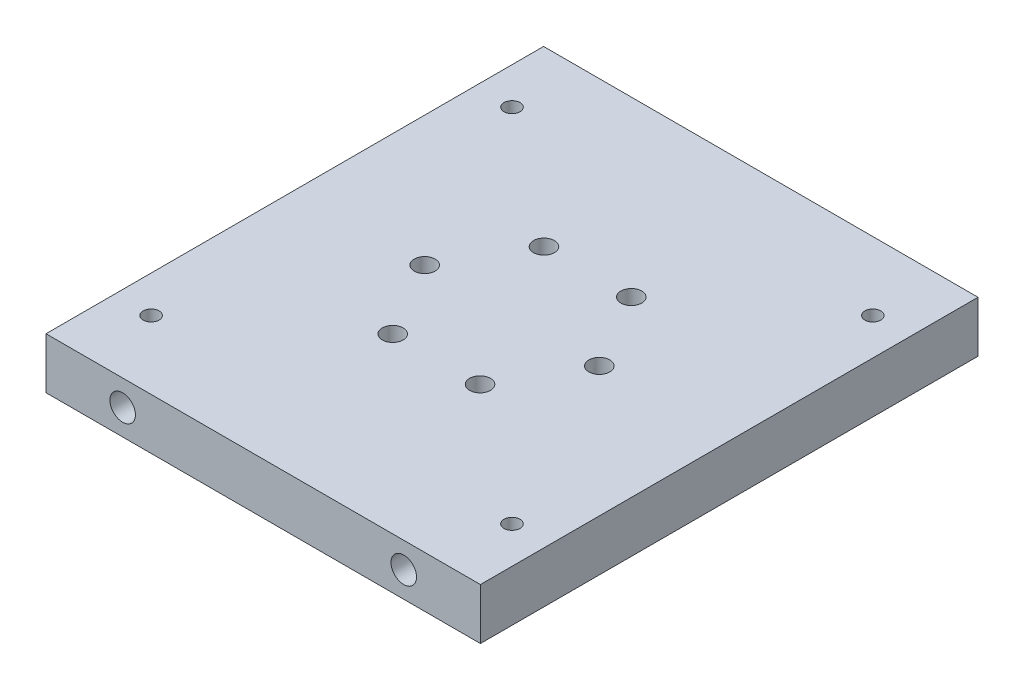
ISO-10303-21;
HEADER;
FILE_DESCRIPTION(('STEP AP214'),'2;1');
FILE_NAME('part.step','',(''),(''),'','','');
FILE_SCHEMA(('AUTOMOTIVE_DESIGN { 1 0 10303 214 1 1 1 1 }'));
ENDSEC;
DATA;
#1=APPLICATION_CONTEXT('core data for automotive mechanical design processes');
#2=APPLICATION_PROTOCOL_DEFINITION('international standard','automotive_design',2000,#1);
#3=PRODUCT_CONTEXT('',#1,'mechanical');
#4=PRODUCT('Part','Part','',(#3));
#5=PRODUCT_RELATED_PRODUCT_CATEGORY('part','',(#4));
#6=PRODUCT_DEFINITION_FORMATION('','',#4);
#7=PRODUCT_DEFINITION_CONTEXT('part definition',#1,'design');
#8=PRODUCT_DEFINITION('design','',#6,#7);
#9=PRODUCT_DEFINITION_SHAPE('','',#8);
#10=(LENGTH_UNIT() NAMED_UNIT(*) SI_UNIT(.MILLI.,.METRE.));
#11=(NAMED_UNIT(*) PLANE_ANGLE_UNIT() SI_UNIT($,.RADIAN.));
#12=(NAMED_UNIT(*) SI_UNIT($,.STERADIAN.) SOLID_ANGLE_UNIT());
#13=UNCERTAINTY_MEASURE_WITH_UNIT(LENGTH_MEASURE(1.E-05),#10,'distance_accuracy_value','');
#14=(GEOMETRIC_REPRESENTATION_CONTEXT(3) GLOBAL_UNCERTAINTY_ASSIGNED_CONTEXT((#13)) GLOBAL_UNIT_ASSIGNED_CONTEXT((#10,
#11,#12)) REPRESENTATION_CONTEXT('',''));
#15=CARTESIAN_POINT('',(0.,0.,0.));
#16=DIRECTION('',(0.,0.,1.));
#17=DIRECTION('',(1.,0.,0.));
#18=AXIS2_PLACEMENT_3D('',#15,#16,#17);
#19=CARTESIAN_POINT('',(0.,0.,123.65));
#20=DIRECTION('',(1.,0.,0.));
#21=DIRECTION('',(0.,1.,0.));
#22=AXIS2_PLACEMENT_3D('',#19,#20,#21);
#23=PLANE('',#22);
#24=DIRECTION('',(0.,-1.,0.));
#25=VECTOR('',#24,1.);
#26=CARTESIAN_POINT('',(0.,0.,0.));
#27=LINE('',#26,#25);
#28=CARTESIAN_POINT('',(0.,0.,0.));
#29=VERTEX_POINT('',#28);
#30=CARTESIAN_POINT('',(0.,-12.7,0.));
#31=VERTEX_POINT('',#30);
#32=EDGE_CURVE('E115',#29,#31,#27,.T.);
#33=ORIENTED_EDGE('',*,*,#32,.T.);
#34=DIRECTION('',(0.,0.,-1.));
#35=VECTOR('',#34,1.);
#36=CARTESIAN_POINT('',(0.,-12.7,123.65));
#37=LINE('',#36,#35);
#38=CARTESIAN_POINT('',(0.,-12.7,123.65));
#39=VERTEX_POINT('',#38);
#40=EDGE_CURVE('E11',#39,#31,#37,.T.);
#41=ORIENTED_EDGE('',*,*,#40,.F.);
#42=DIRECTION('',(0.,-1.,0.));
#43=VECTOR('',#42,1.);
#44=CARTESIAN_POINT('',(0.,0.,123.65));
#45=LINE('',#44,#43);
#46=CARTESIAN_POINT('',(0.,0.,123.65));
#47=VERTEX_POINT('',#46);
#48=EDGE_CURVE('E99',#47,#39,#45,.T.);
#49=ORIENTED_EDGE('',*,*,#48,.F.);
#50=DIRECTION('',(0.,0.,-1.));
#51=VECTOR('',#50,1.);
#52=CARTESIAN_POINT('',(0.,0.,123.65));
#53=LINE('',#52,#51);
#54=EDGE_CURVE('E111',#47,#29,#53,.T.);
#55=ORIENTED_EDGE('',*,*,#54,.T.);
#56=EDGE_LOOP('',(#33,#41,#49,#55));
#57=FACE_BOUND('',#56,.T.);
#58=ADVANCED_FACE('F47',(#57),#23,.F.);
#59=CARTESIAN_POINT('',(0.,-12.7,123.65));
#60=DIRECTION('',(0.,1.,0.));
#61=DIRECTION('',(0.,0.,1.));
#62=AXIS2_PLACEMENT_3D('',#59,#60,#61);
#63=PLANE('',#62);
#64=CARTESIAN_POINT('',(32.275,-12.7,61.825));
#65=DIRECTION('',(0.,1.,0.));
#66=DIRECTION('',(0.,0.,1.));
#67=AXIS2_PLACEMENT_3D('',#64,#65,#66);
#68=CIRCLE('',#67,2.6);
#69=CARTESIAN_POINT('',(32.275,-12.7,64.425));
#70=VERTEX_POINT('',#69);
#71=EDGE_CURVE('E181',#70,#70,#68,.T.);
#72=ORIENTED_EDGE('',*,*,#71,.T.);
#73=EDGE_LOOP('',(#72));
#74=FACE_BOUND('',#73,.T.);
#75=CARTESIAN_POINT('',(43.1249999999998,-12.7,80.6177512621222));
#76=DIRECTION('',(0.,1.,0.));
#77=DIRECTION('',(0.,0.,1.));
#78=AXIS2_PLACEMENT_3D('',#75,#76,#77);
#79=CIRCLE('',#78,2.6);
#80=CARTESIAN_POINT('',(43.1249999999998,-12.7,83.2177512621222));
#81=VERTEX_POINT('',#80);
#82=EDGE_CURVE('E234',#81,#81,#79,.T.);
#83=ORIENTED_EDGE('',*,*,#82,.T.);
#84=EDGE_LOOP('',(#83));
#85=FACE_BOUND('',#84,.T.);
#86=CARTESIAN_POINT('',(64.8249999999998,-12.7,80.6177512621224));
#87=DIRECTION('',(0.,1.,0.));
#88=DIRECTION('',(0.,0.,1.));
#89=AXIS2_PLACEMENT_3D('',#86,#87,#88);
#90=CIRCLE('',#89,2.59999999999998);
#91=CARTESIAN_POINT('',(64.8249999999998,-12.7,83.2177512621224));
#92=VERTEX_POINT('',#91);
#93=EDGE_CURVE('E200',#92,#92,#90,.T.);
#94=ORIENTED_EDGE('',*,*,#93,.T.);
#95=EDGE_LOOP('',(#94));
#96=FACE_BOUND('',#95,.T.);
#97=CARTESIAN_POINT('',(75.675,-12.7,61.8250000000002));
#98=DIRECTION('',(0.,1.,0.));
#99=DIRECTION('',(0.,0.,1.));
#100=AXIS2_PLACEMENT_3D('',#97,#98,#99);
#101=CIRCLE('',#100,2.6);
#102=CARTESIAN_POINT('',(75.675,-12.7,64.4250000000002));
#103=VERTEX_POINT('',#102);
#104=EDGE_CURVE('E209',#103,#103,#101,.T.);
#105=ORIENTED_EDGE('',*,*,#104,.T.);
#106=EDGE_LOOP('',(#105));
#107=FACE_BOUND('',#106,.T.);
#108=CARTESIAN_POINT('',(64.8250000000001,-12.7,43.0322487378777));
#109=DIRECTION('',(0.,1.,0.));
#110=DIRECTION('',(0.,0.,1.));
#111=AXIS2_PLACEMENT_3D('',#108,#109,#110);
#112=CIRCLE('',#111,2.6);
#113=CARTESIAN_POINT('',(64.8250000000001,-12.7,45.6322487378777));
#114=VERTEX_POINT('',#113);
#115=EDGE_CURVE('E217',#114,#114,#112,.T.);
#116=ORIENTED_EDGE('',*,*,#115,.T.);
#117=EDGE_LOOP('',(#116));
#118=FACE_BOUND('',#117,.T.);
#119=CARTESIAN_POINT('',(43.125,-12.7,43.0322487378777));
#120=DIRECTION('',(0.,1.,0.));
#121=DIRECTION('',(0.,0.,1.));
#122=AXIS2_PLACEMENT_3D('',#119,#120,#121);
#123=CIRCLE('',#122,2.6);
#124=CARTESIAN_POINT('',(43.125,-12.7,45.6322487378777));
#125=VERTEX_POINT('',#124);
#126=EDGE_CURVE('E225',#125,#125,#123,.T.);
#127=ORIENTED_EDGE('',*,*,#126,.T.);
#128=EDGE_LOOP('',(#127));
#129=FACE_BOUND('',#128,.T.);
#130=CARTESIAN_POINT('',(9.14,-12.7,16.99));
#131=DIRECTION('',(0.,1.,0.));
#132=DIRECTION('',(0.,0.,1.));
#133=AXIS2_PLACEMENT_3D('',#130,#131,#132);
#134=CIRCLE('',#133,1.985);
#135=CARTESIAN_POINT('',(9.14,-12.7,18.975));
#136=VERTEX_POINT('',#135);
#137=EDGE_CURVE('E176',#136,#136,#134,.T.);
#138=ORIENTED_EDGE('',*,*,#137,.T.);
#139=EDGE_LOOP('',(#138));
#140=FACE_BOUND('',#139,.T.);
#141=CARTESIAN_POINT('',(9.135,-12.7,106.665));
#142=DIRECTION('',(0.,1.,0.));
#143=DIRECTION('',(0.,0.,1.));
#144=AXIS2_PLACEMENT_3D('',#141,#142,#143);
#145=CIRCLE('',#144,1.985);
#146=CARTESIAN_POINT('',(9.135,-12.7,108.65));
#147=VERTEX_POINT('',#146);
#148=EDGE_CURVE('E185',#147,#147,#145,.T.);
#149=ORIENTED_EDGE('',*,*,#148,.T.);
#150=EDGE_LOOP('',(#149));
#151=FACE_BOUND('',#150,.T.);
#152=CARTESIAN_POINT('',(98.81,-12.7,106.665));
#153=DIRECTION('',(0.,1.,0.));
#154=DIRECTION('',(0.,0.,1.));
#155=AXIS2_PLACEMENT_3D('',#152,#153,#154);
#156=CIRCLE('',#155,1.985);
#157=CARTESIAN_POINT('',(98.81,-12.7,108.65));
#158=VERTEX_POINT('',#157);
#159=EDGE_CURVE('E193',#158,#158,#156,.T.);
#160=ORIENTED_EDGE('',*,*,#159,.T.);
#161=EDGE_LOOP('',(#160));
#162=FACE_BOUND('',#161,.T.);
#163=CARTESIAN_POINT('',(98.815,-12.7,16.99));
#164=DIRECTION('',(0.,1.,0.));
#165=DIRECTION('',(0.,0.,1.));
#166=AXIS2_PLACEMENT_3D('',#163,#164,#165);
#167=CIRCLE('',#166,1.98499999999999);
#168=CARTESIAN_POINT('',(98.815,-12.7,18.975));
#169=VERTEX_POINT('',#168);
#170=EDGE_CURVE('E157',#169,#169,#167,.T.);
#171=ORIENTED_EDGE('',*,*,#170,.T.);
#172=EDGE_LOOP('',(#171));
#173=FACE_BOUND('',#172,.T.);
#174=DIRECTION('',(1.,0.,0.));
#175=VECTOR('',#174,1.);
#176=CARTESIAN_POINT('',(0.,-12.7,0.));
#177=LINE('',#176,#175);
#178=CARTESIAN_POINT('',(107.95,-12.7,0.));
#179=VERTEX_POINT('',#178);
#180=EDGE_CURVE('E104',#31,#179,#177,.T.);
#181=ORIENTED_EDGE('',*,*,#180,.T.);
#182=DIRECTION('',(0.,0.,-1.));
#183=VECTOR('',#182,1.);
#184=CARTESIAN_POINT('',(107.95,-12.7,123.65));
#185=LINE('',#184,#183);
#186=CARTESIAN_POINT('',(107.95,-12.7,123.65));
#187=VERTEX_POINT('',#186);
#188=EDGE_CURVE('E56',#187,#179,#185,.T.);
#189=ORIENTED_EDGE('',*,*,#188,.F.);
#190=DIRECTION('',(1.,0.,0.));
#191=VECTOR('',#190,1.);
#192=CARTESIAN_POINT('',(0.,-12.7,123.65));
#193=LINE('',#192,#191);
#194=EDGE_CURVE('E94',#39,#187,#193,.T.);
#195=ORIENTED_EDGE('',*,*,#194,.F.);
#196=ORIENTED_EDGE('',*,*,#40,.T.);
#197=EDGE_LOOP('',(#181,#189,#195,#196));
#198=FACE_BOUND('',#197,.T.);
#199=ADVANCED_FACE('F103',(#74,#85,#96,#107,#118,#129,#140,#151,#162,#173,#198),#63,.F.);
#200=CARTESIAN_POINT('',(107.95,0.,123.65));
#201=DIRECTION('',(-1.,0.,0.));
#202=DIRECTION('',(0.,0.,1.));
#203=AXIS2_PLACEMENT_3D('',#200,#201,#202);
#204=PLANE('',#203);
#205=DIRECTION('',(0.,1.,0.));
#206=VECTOR('',#205,1.);
#207=CARTESIAN_POINT('',(107.95,0.,0.));
#208=LINE('',#207,#206);
#209=CARTESIAN_POINT('',(107.95,0.,0.));
#210=VERTEX_POINT('',#209);
#211=EDGE_CURVE('E81',#179,#210,#208,.T.);
#212=ORIENTED_EDGE('',*,*,#211,.T.);
#213=DIRECTION('',(0.,0.,-1.));
#214=VECTOR('',#213,1.);
#215=CARTESIAN_POINT('',(107.95,0.,123.65));
#216=LINE('',#215,#214);
#217=CARTESIAN_POINT('',(107.95,0.,123.65));
#218=VERTEX_POINT('',#217);
#219=EDGE_CURVE('E106',#218,#210,#216,.T.);
#220=ORIENTED_EDGE('',*,*,#219,.F.);
#221=DIRECTION('',(0.,1.,0.));
#222=VECTOR('',#221,1.);
#223=CARTESIAN_POINT('',(107.95,0.,123.65));
#224=LINE('',#223,#222);
#225=EDGE_CURVE('E97',#187,#218,#224,.T.);
#226=ORIENTED_EDGE('',*,*,#225,.F.);
#227=ORIENTED_EDGE('',*,*,#188,.T.);
#228=EDGE_LOOP('',(#212,#220,#226,#227));
#229=FACE_BOUND('',#228,.T.);
#230=ADVANCED_FACE('F107',(#229),#204,.F.);
#231=CARTESIAN_POINT('',(0.,0.,123.65));
#232=DIRECTION('',(0.,-1.,0.));
#233=DIRECTION('',(0.,0.,-1.));
#234=AXIS2_PLACEMENT_3D('',#231,#232,#233);
#235=PLANE('',#234);
#236=CARTESIAN_POINT('',(32.275,0.,61.825));
#237=DIRECTION('',(0.,1.,0.));
#238=DIRECTION('',(0.,0.,1.));
#239=AXIS2_PLACEMENT_3D('',#236,#237,#238);
#240=CIRCLE('',#239,2.6);
#241=CARTESIAN_POINT('',(32.275,0.,64.425));
#242=VERTEX_POINT('',#241);
#243=EDGE_CURVE('E233',#242,#242,#240,.T.);
#244=ORIENTED_EDGE('',*,*,#243,.F.);
#245=EDGE_LOOP('',(#244));
#246=FACE_BOUND('',#245,.T.);
#247=CARTESIAN_POINT('',(43.1249999999998,0.,80.6177512621222));
#248=DIRECTION('',(0.,1.,0.));
#249=DIRECTION('',(0.,0.,1.));
#250=AXIS2_PLACEMENT_3D('',#247,#248,#249);
#251=CIRCLE('',#250,2.6);
#252=CARTESIAN_POINT('',(43.1249999999998,0.,83.2177512621222));
#253=VERTEX_POINT('',#252);
#254=EDGE_CURVE('E205',#253,#253,#251,.T.);
#255=ORIENTED_EDGE('',*,*,#254,.F.);
#256=EDGE_LOOP('',(#255));
#257=FACE_BOUND('',#256,.T.);
#258=CARTESIAN_POINT('',(64.8249999999998,0.,80.6177512621224));
#259=DIRECTION('',(0.,1.,0.));
#260=DIRECTION('',(0.,0.,1.));
#261=AXIS2_PLACEMENT_3D('',#258,#259,#260);
#262=CIRCLE('',#261,2.59999999999998);
#263=CARTESIAN_POINT('',(64.8249999999998,0.,83.2177512621224));
#264=VERTEX_POINT('',#263);
#265=EDGE_CURVE('E204',#264,#264,#262,.T.);
#266=ORIENTED_EDGE('',*,*,#265,.F.);
#267=EDGE_LOOP('',(#266));
#268=FACE_BOUND('',#267,.T.);
#269=CARTESIAN_POINT('',(75.675,0.,61.8250000000002));
#270=DIRECTION('',(0.,1.,0.));
#271=DIRECTION('',(0.,0.,1.));
#272=AXIS2_PLACEMENT_3D('',#269,#270,#271);
#273=CIRCLE('',#272,2.6);
#274=CARTESIAN_POINT('',(75.675,0.,64.4250000000002));
#275=VERTEX_POINT('',#274);
#276=EDGE_CURVE('E213',#275,#275,#273,.T.);
#277=ORIENTED_EDGE('',*,*,#276,.F.);
#278=EDGE_LOOP('',(#277));
#279=FACE_BOUND('',#278,.T.);
#280=CARTESIAN_POINT('',(64.8250000000001,0.,43.0322487378777));
#281=DIRECTION('',(0.,1.,0.));
#282=DIRECTION('',(0.,0.,1.));
#283=AXIS2_PLACEMENT_3D('',#280,#281,#282);
#284=CIRCLE('',#283,2.6);
#285=CARTESIAN_POINT('',(64.8250000000001,0.,45.6322487378777));
#286=VERTEX_POINT('',#285);
#287=EDGE_CURVE('E221',#286,#286,#284,.T.);
#288=ORIENTED_EDGE('',*,*,#287,.F.);
#289=EDGE_LOOP('',(#288));
#290=FACE_BOUND('',#289,.T.);
#291=CARTESIAN_POINT('',(43.125,0.,43.0322487378777));
#292=DIRECTION('',(0.,1.,0.));
#293=DIRECTION('',(0.,0.,1.));
#294=AXIS2_PLACEMENT_3D('',#291,#292,#293);
#295=CIRCLE('',#294,2.6);
#296=CARTESIAN_POINT('',(43.125,0.,45.6322487378777));
#297=VERTEX_POINT('',#296);
#298=EDGE_CURVE('E229',#297,#297,#295,.T.);
#299=ORIENTED_EDGE('',*,*,#298,.F.);
#300=EDGE_LOOP('',(#299));
#301=FACE_BOUND('',#300,.T.);
#302=CARTESIAN_POINT('',(9.14,0.,16.99));
#303=DIRECTION('',(0.,1.,0.));
#304=DIRECTION('',(0.,0.,1.));
#305=AXIS2_PLACEMENT_3D('',#302,#303,#304);
#306=CIRCLE('',#305,1.985);
#307=CARTESIAN_POINT('',(9.14,0.,18.975));
#308=VERTEX_POINT('',#307);
#309=EDGE_CURVE('E180',#308,#308,#306,.T.);
#310=ORIENTED_EDGE('',*,*,#309,.F.);
#311=EDGE_LOOP('',(#310));
#312=FACE_BOUND('',#311,.T.);
#313=CARTESIAN_POINT('',(9.135,0.,106.665));
#314=DIRECTION('',(0.,1.,0.));
#315=DIRECTION('',(0.,0.,1.));
#316=AXIS2_PLACEMENT_3D('',#313,#314,#315);
#317=CIRCLE('',#316,1.985);
#318=CARTESIAN_POINT('',(9.135,0.,108.65));
#319=VERTEX_POINT('',#318);
#320=EDGE_CURVE('E189',#319,#319,#317,.T.);
#321=ORIENTED_EDGE('',*,*,#320,.F.);
#322=EDGE_LOOP('',(#321));
#323=FACE_BOUND('',#322,.T.);
#324=CARTESIAN_POINT('',(98.81,0.,106.665));
#325=DIRECTION('',(0.,1.,0.));
#326=DIRECTION('',(0.,0.,1.));
#327=AXIS2_PLACEMENT_3D('',#324,#325,#326);
#328=CIRCLE('',#327,1.985);
#329=CARTESIAN_POINT('',(98.81,0.,108.65));
#330=VERTEX_POINT('',#329);
#331=EDGE_CURVE('E172',#330,#330,#328,.T.);
#332=ORIENTED_EDGE('',*,*,#331,.F.);
#333=EDGE_LOOP('',(#332));
#334=FACE_BOUND('',#333,.T.);
#335=CARTESIAN_POINT('',(98.815,0.,16.99));
#336=DIRECTION('',(0.,1.,0.));
#337=DIRECTION('',(0.,0.,1.));
#338=AXIS2_PLACEMENT_3D('',#335,#336,#337);
#339=CIRCLE('',#338,1.98499999999999);
#340=CARTESIAN_POINT('',(98.815,0.,18.975));
#341=VERTEX_POINT('',#340);
#342=EDGE_CURVE('E168',#341,#341,#339,.T.);
#343=ORIENTED_EDGE('',*,*,#342,.F.);
#344=EDGE_LOOP('',(#343));
#345=FACE_BOUND('',#344,.T.);
#346=DIRECTION('',(-1.,0.,0.));
#347=VECTOR('',#346,1.);
#348=CARTESIAN_POINT('',(0.,0.,0.));
#349=LINE('',#348,#347);
#350=EDGE_CURVE('E87',#210,#29,#349,.T.);
#351=ORIENTED_EDGE('',*,*,#350,.T.);
#352=ORIENTED_EDGE('',*,*,#54,.F.);
#353=DIRECTION('',(-1.,0.,0.));
#354=VECTOR('',#353,1.);
#355=CARTESIAN_POINT('',(0.,0.,123.65));
#356=LINE('',#355,#354);
#357=EDGE_CURVE('E64',#218,#47,#356,.T.);
#358=ORIENTED_EDGE('',*,*,#357,.F.);
#359=ORIENTED_EDGE('',*,*,#219,.T.);
#360=EDGE_LOOP('',(#351,#352,#358,#359));
#361=FACE_BOUND('',#360,.T.);
#362=ADVANCED_FACE('F129',(#246,#257,#268,#279,#290,#301,#312,#323,#334,#345,#361),#235,.F.);
#363=CARTESIAN_POINT('',(0.,0.,123.65));
#364=DIRECTION('',(0.,0.,1.));
#365=DIRECTION('',(1.,0.,0.));
#366=AXIS2_PLACEMENT_3D('',#363,#364,#365);
#367=PLANE('',#366);
#368=CARTESIAN_POINT('',(19.05,-6.35,123.65));
#369=DIRECTION('',(0.,0.,1.));
#370=DIRECTION('',(1.,0.,0.));
#371=AXIS2_PLACEMENT_3D('',#368,#369,#370);
#372=CIRCLE('',#371,3.175);
#373=CARTESIAN_POINT('',(22.225,-6.35,123.65));
#374=VERTEX_POINT('',#373);
#375=EDGE_CURVE('E145',#374,#374,#372,.T.);
#376=ORIENTED_EDGE('',*,*,#375,.F.);
#377=EDGE_LOOP('',(#376));
#378=FACE_BOUND('',#377,.T.);
#379=CARTESIAN_POINT('',(88.9,-6.35,123.65));
#380=DIRECTION('',(0.,0.,1.));
#381=DIRECTION('',(1.,0.,0.));
#382=AXIS2_PLACEMENT_3D('',#379,#380,#381);
#383=CIRCLE('',#382,3.175);
#384=CARTESIAN_POINT('',(92.075,-6.35,123.65));
#385=VERTEX_POINT('',#384);
#386=EDGE_CURVE('E140',#385,#385,#383,.T.);
#387=ORIENTED_EDGE('',*,*,#386,.F.);
#388=EDGE_LOOP('',(#387));
#389=FACE_BOUND('',#388,.T.);
#390=ORIENTED_EDGE('',*,*,#48,.T.);
#391=ORIENTED_EDGE('',*,*,#194,.T.);
#392=ORIENTED_EDGE('',*,*,#225,.T.);
#393=ORIENTED_EDGE('',*,*,#357,.T.);
#394=EDGE_LOOP('',(#390,#391,#392,#393));
#395=FACE_BOUND('',#394,.T.);
#396=ADVANCED_FACE('F95',(#378,#389,#395),#367,.T.);
#397=CARTESIAN_POINT('',(0.,0.,0.));
#398=DIRECTION('',(0.,0.,1.));
#399=DIRECTION('',(1.,0.,0.));
#400=AXIS2_PLACEMENT_3D('',#397,#398,#399);
#401=PLANE('',#400);
#402=CARTESIAN_POINT('',(19.05,-6.35,0.));
#403=DIRECTION('',(0.,0.,1.));
#404=DIRECTION('',(1.,0.,0.));
#405=AXIS2_PLACEMENT_3D('',#402,#403,#404);
#406=CIRCLE('',#405,3.175);
#407=CARTESIAN_POINT('',(22.225,-6.35,0.));
#408=VERTEX_POINT('',#407);
#409=EDGE_CURVE('E161',#408,#408,#406,.T.);
#410=ORIENTED_EDGE('',*,*,#409,.T.);
#411=EDGE_LOOP('',(#410));
#412=FACE_BOUND('',#411,.T.);
#413=CARTESIAN_POINT('',(88.9,-6.35,0.));
#414=DIRECTION('',(0.,0.,1.));
#415=DIRECTION('',(1.,0.,0.));
#416=AXIS2_PLACEMENT_3D('',#413,#414,#415);
#417=CIRCLE('',#416,3.175);
#418=CARTESIAN_POINT('',(92.075,-6.35,0.));
#419=VERTEX_POINT('',#418);
#420=EDGE_CURVE('E152',#419,#419,#417,.T.);
#421=ORIENTED_EDGE('',*,*,#420,.T.);
#422=EDGE_LOOP('',(#421));
#423=FACE_BOUND('',#422,.T.);
#424=ORIENTED_EDGE('',*,*,#32,.F.);
#425=ORIENTED_EDGE('',*,*,#350,.F.);
#426=ORIENTED_EDGE('',*,*,#211,.F.);
#427=ORIENTED_EDGE('',*,*,#180,.F.);
#428=EDGE_LOOP('',(#424,#425,#426,#427));
#429=FACE_BOUND('',#428,.T.);
#430=ADVANCED_FACE('F132',(#412,#423,#429),#401,.F.);
#431=CARTESIAN_POINT('',(88.9,-6.35,98.25));
#432=DIRECTION('',(0.,0.,1.));
#433=DIRECTION('',(1.,0.,0.));
#434=AXIS2_PLACEMENT_3D('',#431,#432,#433);
#435=CYLINDRICAL_SURFACE('',#434,3.175);
#436=CARTESIAN_POINT('',(88.9,-6.35,98.25));
#437=DIRECTION('',(0.,0.,1.));
#438=DIRECTION('',(1.,0.,0.));
#439=AXIS2_PLACEMENT_3D('',#436,#437,#438);
#440=CIRCLE('',#439,3.175);
#441=CARTESIAN_POINT('',(92.075,-6.35,98.25));
#442=VERTEX_POINT('',#441);
#443=EDGE_CURVE('E136',#442,#442,#440,.T.);
#444=ORIENTED_EDGE('',*,*,#443,.F.);
#445=EDGE_LOOP('',(#444));
#446=FACE_BOUND('',#445,.T.);
#447=ORIENTED_EDGE('',*,*,#386,.T.);
#448=EDGE_LOOP('',(#447));
#449=FACE_BOUND('',#448,.T.);
#450=ADVANCED_FACE('F309',(#446,#449),#435,.F.);
#451=CARTESIAN_POINT('',(88.9,-6.35,98.25));
#452=DIRECTION('',(0.,0.,1.));
#453=DIRECTION('',(1.,0.,0.));
#454=AXIS2_PLACEMENT_3D('',#451,#452,#453);
#455=PLANE('',#454);
#456=ORIENTED_EDGE('',*,*,#443,.T.);
#457=EDGE_LOOP('',(#456));
#458=FACE_BOUND('',#457,.T.);
#459=ADVANCED_FACE('F314',(#458),#455,.T.);
#460=CARTESIAN_POINT('',(19.05,-6.35,98.25));
#461=DIRECTION('',(0.,0.,1.));
#462=DIRECTION('',(1.,0.,0.));
#463=AXIS2_PLACEMENT_3D('',#460,#461,#462);
#464=CYLINDRICAL_SURFACE('',#463,3.175);
#465=CARTESIAN_POINT('',(19.05,-6.35,98.25));
#466=DIRECTION('',(0.,0.,1.));
#467=DIRECTION('',(1.,0.,0.));
#468=AXIS2_PLACEMENT_3D('',#465,#466,#467);
#469=CIRCLE('',#468,3.175);
#470=CARTESIAN_POINT('',(22.225,-6.35,98.25));
#471=VERTEX_POINT('',#470);
#472=EDGE_CURVE('E119',#471,#471,#469,.T.);
#473=ORIENTED_EDGE('',*,*,#472,.F.);
#474=EDGE_LOOP('',(#473));
#475=FACE_BOUND('',#474,.T.);
#476=ORIENTED_EDGE('',*,*,#375,.T.);
#477=EDGE_LOOP('',(#476));
#478=FACE_BOUND('',#477,.T.);
#479=ADVANCED_FACE('F317',(#475,#478),#464,.F.);
#480=CARTESIAN_POINT('',(19.05,-6.35,98.25));
#481=DIRECTION('',(0.,0.,1.));
#482=DIRECTION('',(1.,0.,0.));
#483=AXIS2_PLACEMENT_3D('',#480,#481,#482);
#484=PLANE('',#483);
#485=ORIENTED_EDGE('',*,*,#472,.T.);
#486=EDGE_LOOP('',(#485));
#487=FACE_BOUND('',#486,.T.);
#488=ADVANCED_FACE('F324',(#487),#484,.T.);
#489=CARTESIAN_POINT('',(88.9,-6.35,25.4));
#490=DIRECTION('',(0.,0.,-1.));
#491=DIRECTION('',(-1.,0.,0.));
#492=AXIS2_PLACEMENT_3D('',#489,#490,#491);
#493=CYLINDRICAL_SURFACE('',#492,3.175);
#494=CARTESIAN_POINT('',(88.9,-6.35,25.4));
#495=DIRECTION('',(0.,0.,1.));
#496=DIRECTION('',(1.,0.,0.));
#497=AXIS2_PLACEMENT_3D('',#494,#495,#496);
#498=CIRCLE('',#497,3.175);
#499=CARTESIAN_POINT('',(92.075,-6.35,25.4));
#500=VERTEX_POINT('',#499);
#501=EDGE_CURVE('E156',#500,#500,#498,.T.);
#502=ORIENTED_EDGE('',*,*,#501,.T.);
#503=EDGE_LOOP('',(#502));
#504=FACE_BOUND('',#503,.T.);
#505=ORIENTED_EDGE('',*,*,#420,.F.);
#506=EDGE_LOOP('',(#505));
#507=FACE_BOUND('',#506,.T.);
#508=ADVANCED_FACE('F328',(#504,#507),#493,.F.);
#509=CARTESIAN_POINT('',(88.9,-6.35,25.4));
#510=DIRECTION('',(0.,0.,-1.));
#511=DIRECTION('',(1.,0.,0.));
#512=AXIS2_PLACEMENT_3D('',#509,#510,#511);
#513=PLANE('',#512);
#514=ORIENTED_EDGE('',*,*,#501,.F.);
#515=EDGE_LOOP('',(#514));
#516=FACE_BOUND('',#515,.T.);
#517=ADVANCED_FACE('F332',(#516),#513,.T.);
#518=CARTESIAN_POINT('',(19.05,-6.35,25.4));
#519=DIRECTION('',(0.,0.,-1.));
#520=DIRECTION('',(-1.,0.,0.));
#521=AXIS2_PLACEMENT_3D('',#518,#519,#520);
#522=CYLINDRICAL_SURFACE('',#521,3.175);
#523=CARTESIAN_POINT('',(19.05,-6.35,25.4));
#524=DIRECTION('',(0.,0.,1.));
#525=DIRECTION('',(1.,0.,0.));
#526=AXIS2_PLACEMENT_3D('',#523,#524,#525);
#527=CIRCLE('',#526,3.175);
#528=CARTESIAN_POINT('',(22.225,-6.35,25.4));
#529=VERTEX_POINT('',#528);
#530=EDGE_CURVE('E141',#529,#529,#527,.T.);
#531=ORIENTED_EDGE('',*,*,#530,.T.);
#532=EDGE_LOOP('',(#531));
#533=FACE_BOUND('',#532,.T.);
#534=ORIENTED_EDGE('',*,*,#409,.F.);
#535=EDGE_LOOP('',(#534));
#536=FACE_BOUND('',#535,.T.);
#537=ADVANCED_FACE('F292',(#533,#536),#522,.F.);
#538=CARTESIAN_POINT('',(19.05,-6.35,25.4));
#539=DIRECTION('',(0.,0.,-1.));
#540=DIRECTION('',(1.,0.,0.));
#541=AXIS2_PLACEMENT_3D('',#538,#539,#540);
#542=PLANE('',#541);
#543=ORIENTED_EDGE('',*,*,#530,.F.);
#544=EDGE_LOOP('',(#543));
#545=FACE_BOUND('',#544,.T.);
#546=ADVANCED_FACE('F281',(#545),#542,.T.);
#547=CARTESIAN_POINT('',(98.815,-12.7,16.99));
#548=DIRECTION('',(0.,1.,0.));
#549=DIRECTION('',(0.,0.,1.));
#550=AXIS2_PLACEMENT_3D('',#547,#548,#549);
#551=CYLINDRICAL_SURFACE('',#550,1.98499999999999);
#552=ORIENTED_EDGE('',*,*,#170,.F.);
#553=EDGE_LOOP('',(#552));
#554=FACE_BOUND('',#553,.T.);
#555=ORIENTED_EDGE('',*,*,#342,.T.);
#556=EDGE_LOOP('',(#555));
#557=FACE_BOUND('',#556,.T.);
#558=ADVANCED_FACE('F278',(#554,#557),#551,.F.);
#559=CARTESIAN_POINT('',(98.81,-12.7,106.665));
#560=DIRECTION('',(0.,1.,0.));
#561=DIRECTION('',(0.,0.,1.));
#562=AXIS2_PLACEMENT_3D('',#559,#560,#561);
#563=CYLINDRICAL_SURFACE('',#562,1.985);
#564=ORIENTED_EDGE('',*,*,#159,.F.);
#565=EDGE_LOOP('',(#564));
#566=FACE_BOUND('',#565,.T.);
#567=ORIENTED_EDGE('',*,*,#331,.T.);
#568=EDGE_LOOP('',(#567));
#569=FACE_BOUND('',#568,.T.);
#570=ADVANCED_FACE('F280',(#566,#569),#563,.F.);
#571=CARTESIAN_POINT('',(9.135,-12.7,106.665));
#572=DIRECTION('',(0.,1.,0.));
#573=DIRECTION('',(0.,0.,1.));
#574=AXIS2_PLACEMENT_3D('',#571,#572,#573);
#575=CYLINDRICAL_SURFACE('',#574,1.985);
#576=ORIENTED_EDGE('',*,*,#148,.F.);
#577=EDGE_LOOP('',(#576));
#578=FACE_BOUND('',#577,.T.);
#579=ORIENTED_EDGE('',*,*,#320,.T.);
#580=EDGE_LOOP('',(#579));
#581=FACE_BOUND('',#580,.T.);
#582=ADVANCED_FACE('F288',(#578,#581),#575,.F.);
#583=CARTESIAN_POINT('',(9.14,-12.7,16.99));
#584=DIRECTION('',(0.,1.,0.));
#585=DIRECTION('',(0.,0.,1.));
#586=AXIS2_PLACEMENT_3D('',#583,#584,#585);
#587=CYLINDRICAL_SURFACE('',#586,1.985);
#588=ORIENTED_EDGE('',*,*,#137,.F.);
#589=EDGE_LOOP('',(#588));
#590=FACE_BOUND('',#589,.T.);
#591=ORIENTED_EDGE('',*,*,#309,.T.);
#592=EDGE_LOOP('',(#591));
#593=FACE_BOUND('',#592,.T.);
#594=ADVANCED_FACE('F378',(#590,#593),#587,.F.);
#595=CARTESIAN_POINT('',(43.125,-12.7,43.0322487378777));
#596=DIRECTION('',(0.,1.,0.));
#597=DIRECTION('',(0.,0.,1.));
#598=AXIS2_PLACEMENT_3D('',#595,#596,#597);
#599=CYLINDRICAL_SURFACE('',#598,2.6);
#600=ORIENTED_EDGE('',*,*,#126,.F.);
#601=EDGE_LOOP('',(#600));
#602=FACE_BOUND('',#601,.T.);
#603=ORIENTED_EDGE('',*,*,#298,.T.);
#604=EDGE_LOOP('',(#603));
#605=FACE_BOUND('',#604,.T.);
#606=ADVANCED_FACE('F387',(#602,#605),#599,.F.);
#607=CARTESIAN_POINT('',(64.8250000000001,-12.7,43.0322487378777));
#608=DIRECTION('',(0.,1.,0.));
#609=DIRECTION('',(0.,0.,1.));
#610=AXIS2_PLACEMENT_3D('',#607,#608,#609);
#611=CYLINDRICAL_SURFACE('',#610,2.6);
#612=ORIENTED_EDGE('',*,*,#115,.F.);
#613=EDGE_LOOP('',(#612));
#614=FACE_BOUND('',#613,.T.);
#615=ORIENTED_EDGE('',*,*,#287,.T.);
#616=EDGE_LOOP('',(#615));
#617=FACE_BOUND('',#616,.T.);
#618=ADVANCED_FACE('F396',(#614,#617),#611,.F.);
#619=CARTESIAN_POINT('',(75.675,-12.7,61.8250000000002));
#620=DIRECTION('',(0.,1.,0.));
#621=DIRECTION('',(0.,0.,1.));
#622=AXIS2_PLACEMENT_3D('',#619,#620,#621);
#623=CYLINDRICAL_SURFACE('',#622,2.6);
#624=ORIENTED_EDGE('',*,*,#104,.F.);
#625=EDGE_LOOP('',(#624));
#626=FACE_BOUND('',#625,.T.);
#627=ORIENTED_EDGE('',*,*,#276,.T.);
#628=EDGE_LOOP('',(#627));
#629=FACE_BOUND('',#628,.T.);
#630=ADVANCED_FACE('F406',(#626,#629),#623,.F.);
#631=CARTESIAN_POINT('',(64.8249999999998,-12.7,80.6177512621224));
#632=DIRECTION('',(0.,1.,0.));
#633=DIRECTION('',(0.,0.,1.));
#634=AXIS2_PLACEMENT_3D('',#631,#632,#633);
#635=CYLINDRICAL_SURFACE('',#634,2.59999999999998);
#636=ORIENTED_EDGE('',*,*,#93,.F.);
#637=EDGE_LOOP('',(#636));
#638=FACE_BOUND('',#637,.T.);
#639=ORIENTED_EDGE('',*,*,#265,.T.);
#640=EDGE_LOOP('',(#639));
#641=FACE_BOUND('',#640,.T.);
#642=ADVANCED_FACE('F416',(#638,#641),#635,.F.);
#643=CARTESIAN_POINT('',(43.1249999999998,-12.7,80.6177512621222));
#644=DIRECTION('',(0.,1.,0.));
#645=DIRECTION('',(0.,0.,1.));
#646=AXIS2_PLACEMENT_3D('',#643,#644,#645);
#647=CYLINDRICAL_SURFACE('',#646,2.6);
#648=ORIENTED_EDGE('',*,*,#82,.F.);
#649=EDGE_LOOP('',(#648));
#650=FACE_BOUND('',#649,.T.);
#651=ORIENTED_EDGE('',*,*,#254,.T.);
#652=EDGE_LOOP('',(#651));
#653=FACE_BOUND('',#652,.T.);
#654=ADVANCED_FACE('F253',(#650,#653),#647,.F.);
#655=CARTESIAN_POINT('',(32.275,-12.7,61.825));
#656=DIRECTION('',(0.,1.,0.));
#657=DIRECTION('',(0.,0.,1.));
#658=AXIS2_PLACEMENT_3D('',#655,#656,#657);
#659=CYLINDRICAL_SURFACE('',#658,2.6);
#660=ORIENTED_EDGE('',*,*,#71,.F.);
#661=EDGE_LOOP('',(#660));
#662=FACE_BOUND('',#661,.T.);
#663=ORIENTED_EDGE('',*,*,#243,.T.);
#664=EDGE_LOOP('',(#663));
#665=FACE_BOUND('',#664,.T.);
#666=ADVANCED_FACE('F250',(#662,#665),#659,.F.);
#667=CLOSED_SHELL('',(#58,#199,#230,#362,#396,#430,#450,#459,#479,#488,#508,#517,#537,#546,#558,
#570,#582,#594,#606,#618,#630,#642,#654,#666));
#668=MANIFOLD_SOLID_BREP('B2',#667);
#669=ADVANCED_BREP_SHAPE_REPRESENTATION('',(#18,#668),#14);
#670=SHAPE_DEFINITION_REPRESENTATION(#9,#669);
ENDSEC;
END-ISO-10303-21;
